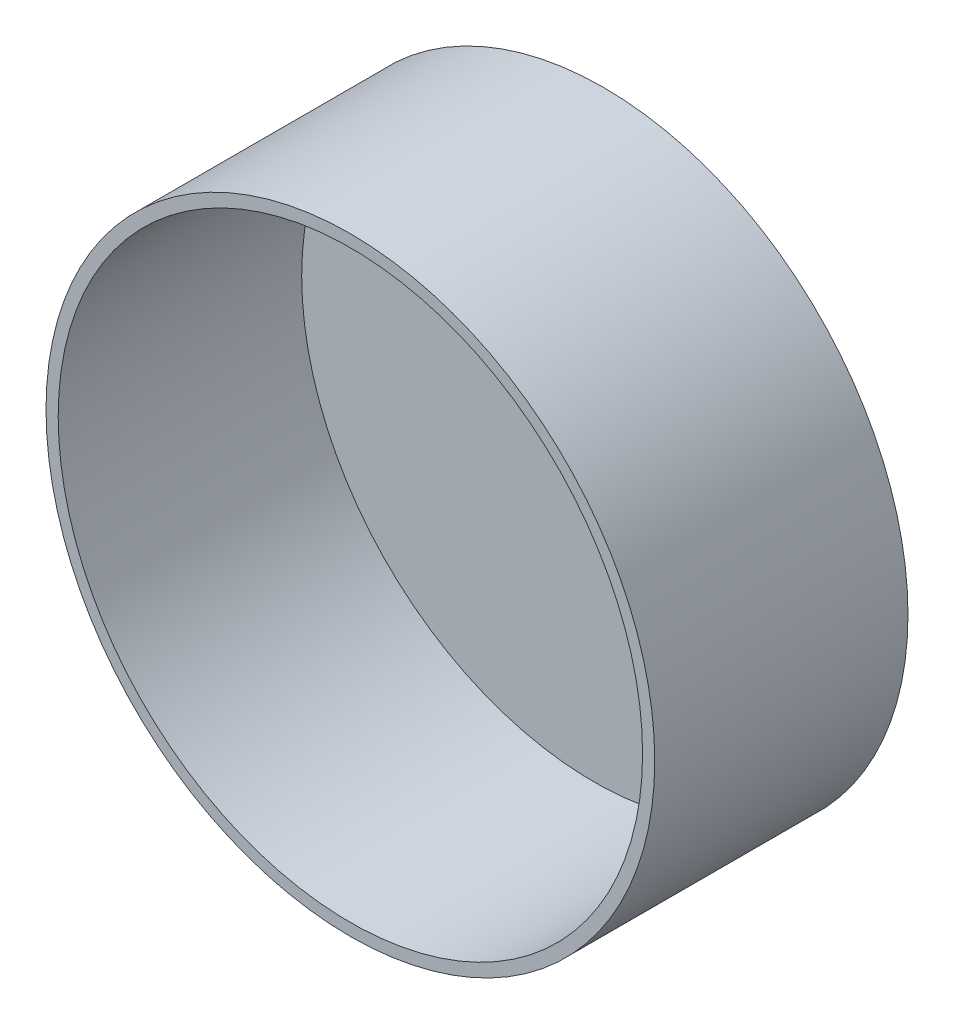
ISO-10303-21;
HEADER;
FILE_DESCRIPTION(('STEP AP214'),'2;1');
FILE_NAME('part.step','',(''),(''),'','','');
FILE_SCHEMA(('AUTOMOTIVE_DESIGN { 1 0 10303 214 1 1 1 1 }'));
ENDSEC;
DATA;
#1=APPLICATION_CONTEXT('core data for automotive mechanical design processes');
#2=APPLICATION_PROTOCOL_DEFINITION('international standard','automotive_design',2000,#1);
#3=PRODUCT_CONTEXT('',#1,'mechanical');
#4=PRODUCT('Part','Part','',(#3));
#5=PRODUCT_RELATED_PRODUCT_CATEGORY('part','',(#4));
#6=PRODUCT_DEFINITION_FORMATION('','',#4);
#7=PRODUCT_DEFINITION_CONTEXT('part definition',#1,'design');
#8=PRODUCT_DEFINITION('design','',#6,#7);
#9=PRODUCT_DEFINITION_SHAPE('','',#8);
#10=(LENGTH_UNIT() NAMED_UNIT(*) SI_UNIT(.MILLI.,.METRE.));
#11=(NAMED_UNIT(*) PLANE_ANGLE_UNIT() SI_UNIT($,.RADIAN.));
#12=(NAMED_UNIT(*) SI_UNIT($,.STERADIAN.) SOLID_ANGLE_UNIT());
#13=UNCERTAINTY_MEASURE_WITH_UNIT(LENGTH_MEASURE(1.E-05),#10,'distance_accuracy_value','');
#14=(GEOMETRIC_REPRESENTATION_CONTEXT(3) GLOBAL_UNCERTAINTY_ASSIGNED_CONTEXT((#13)) GLOBAL_UNIT_ASSIGNED_CONTEXT((#10,
#11,#12)) REPRESENTATION_CONTEXT('',''));
#15=CARTESIAN_POINT('',(0.,0.,0.));
#16=DIRECTION('',(0.,0.,1.));
#17=DIRECTION('',(1.,0.,0.));
#18=AXIS2_PLACEMENT_3D('',#15,#16,#17);
#19=CARTESIAN_POINT('',(0.,0.,4.));
#20=DIRECTION('',(0.,0.,-1.));
#21=DIRECTION('',(-1.,0.,0.));
#22=AXIS2_PLACEMENT_3D('',#19,#20,#21);
#23=CYLINDRICAL_SURFACE('',#22,125.);
#24=CARTESIAN_POINT('',(0.,0.,0.));
#25=DIRECTION('',(0.,0.,1.));
#26=DIRECTION('',(1.,0.,0.));
#27=AXIS2_PLACEMENT_3D('',#24,#25,#26);
#28=CIRCLE('',#27,125.);
#29=CARTESIAN_POINT('',(125.,0.,0.));
#30=VERTEX_POINT('',#29);
#31=EDGE_CURVE('E37',#30,#30,#28,.T.);
#32=ORIENTED_EDGE('',*,*,#31,.T.);
#33=EDGE_LOOP('',(#32));
#34=FACE_BOUND('',#33,.T.);
#35=CARTESIAN_POINT('',(0.,0.,104.));
#36=DIRECTION('',(0.,0.,1.));
#37=DIRECTION('',(1.,0.,0.));
#38=AXIS2_PLACEMENT_3D('',#35,#36,#37);
#39=CIRCLE('',#38,125.);
#40=CARTESIAN_POINT('',(125.,0.,104.));
#41=VERTEX_POINT('',#40);
#42=EDGE_CURVE('E41',#41,#41,#39,.T.);
#43=ORIENTED_EDGE('',*,*,#42,.F.);
#44=EDGE_LOOP('',(#43));
#45=FACE_BOUND('',#44,.T.);
#46=ADVANCED_FACE('F31',(#34,#45),#23,.T.);
#47=CARTESIAN_POINT('',(0.,0.,0.));
#48=DIRECTION('',(0.,0.,1.));
#49=DIRECTION('',(1.,0.,0.));
#50=AXIS2_PLACEMENT_3D('',#47,#48,#49);
#51=PLANE('',#50);
#52=ORIENTED_EDGE('',*,*,#31,.F.);
#53=EDGE_LOOP('',(#52));
#54=FACE_BOUND('',#53,.T.);
#55=ADVANCED_FACE('F55',(#54),#51,.F.);
#56=CARTESIAN_POINT('',(0.,0.,104.));
#57=DIRECTION('',(0.,0.,1.));
#58=DIRECTION('',(1.,0.,0.));
#59=AXIS2_PLACEMENT_3D('',#56,#57,#58);
#60=PLANE('',#59);
#61=ORIENTED_EDGE('',*,*,#42,.T.);
#62=EDGE_LOOP('',(#61));
#63=FACE_BOUND('',#62,.T.);
#64=CARTESIAN_POINT('',(0.,0.,104.));
#65=DIRECTION('',(0.,0.,1.));
#66=DIRECTION('',(1.,0.,0.));
#67=AXIS2_PLACEMENT_3D('',#64,#65,#66);
#68=CIRCLE('',#67,120.);
#69=CARTESIAN_POINT('',(120.,0.,104.));
#70=VERTEX_POINT('',#69);
#71=EDGE_CURVE('E45',#70,#70,#68,.T.);
#72=ORIENTED_EDGE('',*,*,#71,.F.);
#73=EDGE_LOOP('',(#72));
#74=FACE_BOUND('',#73,.T.);
#75=ADVANCED_FACE('F53',(#63,#74),#60,.T.);
#76=CARTESIAN_POINT('',(0.,0.,104.));
#77=DIRECTION('',(0.,0.,-1.));
#78=DIRECTION('',(-1.,0.,0.));
#79=AXIS2_PLACEMENT_3D('',#76,#77,#78);
#80=CYLINDRICAL_SURFACE('',#79,120.);
#81=ORIENTED_EDGE('',*,*,#71,.T.);
#82=EDGE_LOOP('',(#81));
#83=FACE_BOUND('',#82,.T.);
#84=CARTESIAN_POINT('',(0.,0.,4.));
#85=DIRECTION('',(0.,0.,1.));
#86=DIRECTION('',(1.,0.,0.));
#87=AXIS2_PLACEMENT_3D('',#84,#85,#86);
#88=CIRCLE('',#87,120.);
#89=CARTESIAN_POINT('',(120.,0.,4.));
#90=VERTEX_POINT('',#89);
#91=EDGE_CURVE('E10',#90,#90,#88,.F.);
#92=ORIENTED_EDGE('',*,*,#91,.T.);
#93=EDGE_LOOP('',(#92));
#94=FACE_BOUND('',#93,.T.);
#95=ADVANCED_FACE('F51',(#83,#94),#80,.F.);
#96=CARTESIAN_POINT('',(0.,0.,4.));
#97=DIRECTION('',(0.,0.,1.));
#98=DIRECTION('',(1.,0.,0.));
#99=AXIS2_PLACEMENT_3D('',#96,#97,#98);
#100=PLANE('',#99);
#101=ORIENTED_EDGE('',*,*,#91,.F.);
#102=EDGE_LOOP('',(#101));
#103=FACE_BOUND('',#102,.T.);
#104=ADVANCED_FACE('F62',(#103),#100,.T.);
#105=CLOSED_SHELL('',(#46,#55,#75,#95,#104));
#106=MANIFOLD_SOLID_BREP('B2',#105);
#107=ADVANCED_BREP_SHAPE_REPRESENTATION('',(#18,#106),#14);
#108=SHAPE_DEFINITION_REPRESENTATION(#9,#107);
ENDSEC;
END-ISO-10303-21;
